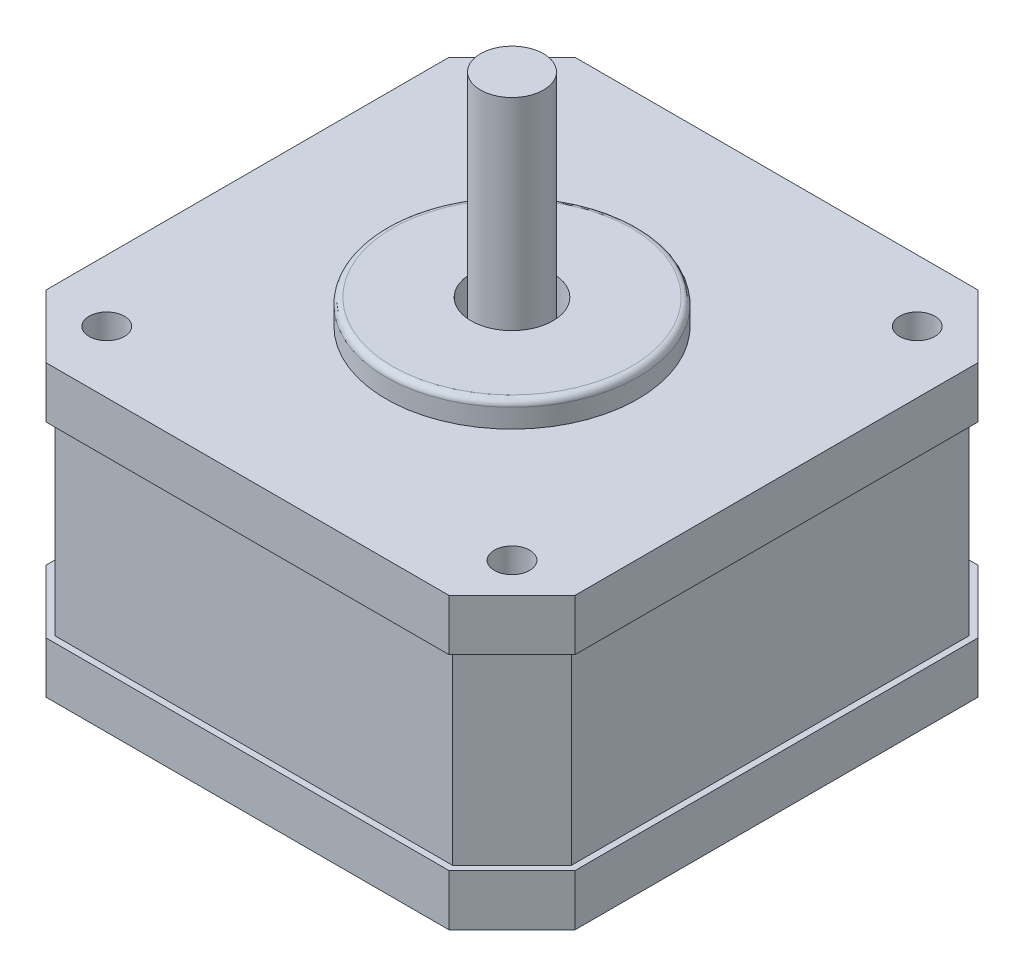
ISO-10303-21;
HEADER;
FILE_DESCRIPTION(('STEP AP214'),'2;1');
FILE_NAME('part.step','',(''),(''),'','','');
FILE_SCHEMA(('AUTOMOTIVE_DESIGN { 1 0 10303 214 1 1 1 1 }'));
ENDSEC;
DATA;
#1=APPLICATION_CONTEXT('core data for automotive mechanical design processes');
#2=APPLICATION_PROTOCOL_DEFINITION('international standard','automotive_design',2000,#1);
#3=PRODUCT_CONTEXT('',#1,'mechanical');
#4=PRODUCT('Part','Part','',(#3));
#5=PRODUCT_RELATED_PRODUCT_CATEGORY('part','',(#4));
#6=PRODUCT_DEFINITION_FORMATION('','',#4);
#7=PRODUCT_DEFINITION_CONTEXT('part definition',#1,'design');
#8=PRODUCT_DEFINITION('design','',#6,#7);
#9=PRODUCT_DEFINITION_SHAPE('','',#8);
#10=(LENGTH_UNIT() NAMED_UNIT(*) SI_UNIT(.MILLI.,.METRE.));
#11=(NAMED_UNIT(*) PLANE_ANGLE_UNIT() SI_UNIT($,.RADIAN.));
#12=(NAMED_UNIT(*) SI_UNIT($,.STERADIAN.) SOLID_ANGLE_UNIT());
#13=UNCERTAINTY_MEASURE_WITH_UNIT(LENGTH_MEASURE(1.E-05),#10,'distance_accuracy_value','');
#14=(GEOMETRIC_REPRESENTATION_CONTEXT(3) GLOBAL_UNCERTAINTY_ASSIGNED_CONTEXT((#13)) GLOBAL_UNIT_ASSIGNED_CONTEXT((#10,
#11,#12)) REPRESENTATION_CONTEXT('',''));
#15=CARTESIAN_POINT('',(0.,0.,0.));
#16=DIRECTION('',(0.,0.,1.));
#17=DIRECTION('',(1.,0.,0.));
#18=AXIS2_PLACEMENT_3D('',#15,#16,#17);
#19=CARTESIAN_POINT('',(0.,0.,-20.5));
#20=DIRECTION('',(0.,0.,1.));
#21=DIRECTION('',(-1.,0.,0.));
#22=AXIS2_PLACEMENT_3D('',#19,#20,#21);
#23=PLANE('',#22);
#24=DIRECTION('',(0.,1.,0.));
#25=VECTOR('',#24,1.);
#26=CARTESIAN_POINT('',(15.7928932188135,0.,-20.5));
#27=LINE('',#26,#25);
#28=CARTESIAN_POINT('',(15.7928932188135,4.07772584032516,-20.5));
#29=VERTEX_POINT('',#28);
#30=CARTESIAN_POINT('',(15.7928932188135,18.9222741596748,-20.5));
#31=VERTEX_POINT('',#30);
#32=EDGE_CURVE('E532',#29,#31,#27,.T.);
#33=ORIENTED_EDGE('',*,*,#32,.F.);
#34=DIRECTION('',(1.,0.,0.));
#35=VECTOR('',#34,1.);
#36=CARTESIAN_POINT('',(-36.7941492494595,4.07772584032516,-20.5));
#37=LINE('',#36,#35);
#38=CARTESIAN_POINT('',(-15.7928932188135,4.07772584032516,-20.5));
#39=VERTEX_POINT('',#38);
#40=EDGE_CURVE('E210',#39,#29,#37,.T.);
#41=ORIENTED_EDGE('',*,*,#40,.F.);
#42=DIRECTION('',(0.,-1.,0.));
#43=VECTOR('',#42,1.);
#44=CARTESIAN_POINT('',(-15.7928932188135,0.,-20.5));
#45=LINE('',#44,#43);
#46=CARTESIAN_POINT('',(-15.7928932188135,18.9222741596748,-20.5));
#47=VERTEX_POINT('',#46);
#48=EDGE_CURVE('E361',#47,#39,#45,.T.);
#49=ORIENTED_EDGE('',*,*,#48,.F.);
#50=DIRECTION('',(-1.,0.,0.));
#51=VECTOR('',#50,1.);
#52=CARTESIAN_POINT('',(-36.7941492494595,18.9222741596748,-20.5));
#53=LINE('',#52,#51);
#54=EDGE_CURVE('E242',#31,#47,#53,.T.);
#55=ORIENTED_EDGE('',*,*,#54,.F.);
#56=EDGE_LOOP('',(#33,#41,#49,#55));
#57=FACE_BOUND('',#56,.T.);
#58=ADVANCED_FACE('F32',(#57),#23,.F.);
#59=CARTESIAN_POINT('',(16.,23.,-21.));
#60=DIRECTION('',(-0.707106781186549,0.,0.707106781186547));
#61=DIRECTION('',(0.,-1.,0.));
#62=AXIS2_PLACEMENT_3D('',#59,#60,#61);
#63=PLANE('',#62);
#64=DIRECTION('',(0.,1.,0.));
#65=VECTOR('',#64,1.);
#66=CARTESIAN_POINT('',(21.,23.,-16.));
#67=LINE('',#66,#65);
#68=CARTESIAN_POINT('',(21.,18.9222741596748,-16.));
#69=VERTEX_POINT('',#68);
#70=CARTESIAN_POINT('',(21.,23.,-16.));
#71=VERTEX_POINT('',#70);
#72=EDGE_CURVE('E338',#69,#71,#67,.T.);
#73=ORIENTED_EDGE('',*,*,#72,.F.);
#74=DIRECTION('',(0.707106781186547,0.,0.707106781186549));
#75=VECTOR('',#74,1.);
#76=CARTESIAN_POINT('',(16.,18.9222741596748,-21.));
#77=LINE('',#76,#75);
#78=CARTESIAN_POINT('',(16.,18.9222741596748,-21.));
#79=VERTEX_POINT('',#78);
#80=EDGE_CURVE('E249',#69,#79,#77,.F.);
#81=ORIENTED_EDGE('',*,*,#80,.T.);
#82=DIRECTION('',(0.,-1.,0.));
#83=VECTOR('',#82,1.);
#84=CARTESIAN_POINT('',(16.,23.,-21.));
#85=LINE('',#84,#83);
#86=CARTESIAN_POINT('',(16.,23.,-21.));
#87=VERTEX_POINT('',#86);
#88=EDGE_CURVE('E333',#87,#79,#85,.T.);
#89=ORIENTED_EDGE('',*,*,#88,.F.);
#90=DIRECTION('',(0.707106781186547,0.,0.707106781186549));
#91=VECTOR('',#90,1.);
#92=CARTESIAN_POINT('',(16.,23.,-21.));
#93=LINE('',#92,#91);
#94=EDGE_CURVE('E342',#71,#87,#93,.F.);
#95=ORIENTED_EDGE('',*,*,#94,.F.);
#96=EDGE_LOOP('',(#73,#81,#89,#95));
#97=FACE_BOUND('',#96,.T.);
#98=ADVANCED_FACE('F389',(#97),#63,.F.);
#99=CARTESIAN_POINT('',(20.5,0.,0.));
#100=DIRECTION('',(-1.,0.,0.));
#101=DIRECTION('',(0.,0.,1.));
#102=AXIS2_PLACEMENT_3D('',#99,#100,#101);
#103=PLANE('',#102);
#104=DIRECTION('',(0.,-1.,0.));
#105=VECTOR('',#104,1.);
#106=CARTESIAN_POINT('',(20.5,0.,-15.7928932188134));
#107=LINE('',#106,#105);
#108=CARTESIAN_POINT('',(20.5,18.9222741596748,-15.7928932188134));
#109=VERTEX_POINT('',#108);
#110=CARTESIAN_POINT('',(20.5,4.07772584032516,-15.7928932188134));
#111=VERTEX_POINT('',#110);
#112=EDGE_CURVE('E190',#109,#111,#107,.T.);
#113=ORIENTED_EDGE('',*,*,#112,.F.);
#114=DIRECTION('',(0.,0.,1.));
#115=VECTOR('',#114,1.);
#116=CARTESIAN_POINT('',(20.5,18.9222741596748,24.2519215951769));
#117=LINE('',#116,#115);
#118=CARTESIAN_POINT('',(20.5,18.9222741596748,15.7928932188134));
#119=VERTEX_POINT('',#118);
#120=EDGE_CURVE('E217',#109,#119,#117,.T.);
#121=ORIENTED_EDGE('',*,*,#120,.T.);
#122=DIRECTION('',(0.,-1.,0.));
#123=VECTOR('',#122,1.);
#124=CARTESIAN_POINT('',(20.5,0.,15.7928932188134));
#125=LINE('',#124,#123);
#126=CARTESIAN_POINT('',(20.5,4.07772584032516,15.7928932188134));
#127=VERTEX_POINT('',#126);
#128=EDGE_CURVE('E215',#119,#127,#125,.T.);
#129=ORIENTED_EDGE('',*,*,#128,.T.);
#130=DIRECTION('',(0.,0.,-1.));
#131=VECTOR('',#130,1.);
#132=CARTESIAN_POINT('',(20.5,4.07772584032516,24.2519215951769));
#133=LINE('',#132,#131);
#134=EDGE_CURVE('E207',#127,#111,#133,.T.);
#135=ORIENTED_EDGE('',*,*,#134,.T.);
#136=EDGE_LOOP('',(#113,#121,#129,#135));
#137=FACE_BOUND('',#136,.T.);
#138=ADVANCED_FACE('F213',(#137),#103,.F.);
#139=CARTESIAN_POINT('',(-21.,23.,21.));
#140=DIRECTION('',(1.,0.,0.));
#141=DIRECTION('',(0.,0.,-1.));
#142=AXIS2_PLACEMENT_3D('',#139,#140,#141);
#143=PLANE('',#142);
#144=DIRECTION('',(0.,0.,-1.));
#145=VECTOR('',#144,1.);
#146=CARTESIAN_POINT('',(-21.,4.07772584032516,21.));
#147=LINE('',#146,#145);
#148=CARTESIAN_POINT('',(-21.,4.07772584032516,16.));
#149=VERTEX_POINT('',#148);
#150=CARTESIAN_POINT('',(-21.,4.07772584032516,-16.));
#151=VERTEX_POINT('',#150);
#152=EDGE_CURVE('E258',#149,#151,#147,.T.);
#153=ORIENTED_EDGE('',*,*,#152,.T.);
#154=DIRECTION('',(0.,-1.,0.));
#155=VECTOR('',#154,1.);
#156=CARTESIAN_POINT('',(-21.,23.,-16.));
#157=LINE('',#156,#155);
#158=CARTESIAN_POINT('',(-21.,0.,-16.));
#159=VERTEX_POINT('',#158);
#160=EDGE_CURVE('E344',#151,#159,#157,.T.);
#161=ORIENTED_EDGE('',*,*,#160,.T.);
#162=DIRECTION('',(0.,0.,1.));
#163=VECTOR('',#162,1.);
#164=CARTESIAN_POINT('',(-21.,0.,21.));
#165=LINE('',#164,#163);
#166=CARTESIAN_POINT('',(-21.,0.,16.));
#167=VERTEX_POINT('',#166);
#168=EDGE_CURVE('E289',#159,#167,#165,.T.);
#169=ORIENTED_EDGE('',*,*,#168,.T.);
#170=DIRECTION('',(0.,1.,0.));
#171=VECTOR('',#170,1.);
#172=CARTESIAN_POINT('',(-21.,23.,16.));
#173=LINE('',#172,#171);
#174=EDGE_CURVE('E311',#167,#149,#173,.T.);
#175=ORIENTED_EDGE('',*,*,#174,.T.);
#176=EDGE_LOOP('',(#153,#161,#169,#175));
#177=FACE_BOUND('',#176,.T.);
#178=ADVANCED_FACE('F439',(#177),#143,.F.);
#179=CARTESIAN_POINT('',(21.,23.,21.));
#180=DIRECTION('',(-1.,0.,0.));
#181=DIRECTION('',(0.,0.,1.));
#182=AXIS2_PLACEMENT_3D('',#179,#180,#181);
#183=PLANE('',#182);
#184=CARTESIAN_POINT('',(21.,0.,-16.));
#185=VERTEX_POINT('',#184);
#186=CARTESIAN_POINT('',(21.,4.07772584032516,-16.));
#187=VERTEX_POINT('',#186);
#188=EDGE_CURVE('E339',#185,#187,#67,.T.);
#189=ORIENTED_EDGE('',*,*,#188,.T.);
#190=DIRECTION('',(0.,0.,-1.));
#191=VECTOR('',#190,1.);
#192=CARTESIAN_POINT('',(21.,4.07772584032516,21.));
#193=LINE('',#192,#191);
#194=CARTESIAN_POINT('',(21.,4.07772584032516,16.));
#195=VERTEX_POINT('',#194);
#196=EDGE_CURVE('E229',#195,#187,#193,.T.);
#197=ORIENTED_EDGE('',*,*,#196,.F.);
#198=DIRECTION('',(0.,-1.,0.));
#199=VECTOR('',#198,1.);
#200=CARTESIAN_POINT('',(21.,23.,16.));
#201=LINE('',#200,#199);
#202=CARTESIAN_POINT('',(21.,0.,16.));
#203=VERTEX_POINT('',#202);
#204=EDGE_CURVE('E316',#195,#203,#201,.T.);
#205=ORIENTED_EDGE('',*,*,#204,.T.);
#206=DIRECTION('',(0.,0.,-1.));
#207=VECTOR('',#206,1.);
#208=CARTESIAN_POINT('',(21.,0.,21.));
#209=LINE('',#208,#207);
#210=EDGE_CURVE('E269',#203,#185,#209,.T.);
#211=ORIENTED_EDGE('',*,*,#210,.T.);
#212=EDGE_LOOP('',(#189,#197,#205,#211));
#213=FACE_BOUND('',#212,.T.);
#214=ADVANCED_FACE('F411',(#213),#183,.F.);
#215=CARTESIAN_POINT('',(0.,0.,20.5));
#216=DIRECTION('',(0.,0.,-1.));
#217=DIRECTION('',(-1.,0.,0.));
#218=AXIS2_PLACEMENT_3D('',#215,#216,#217);
#219=PLANE('',#218);
#220=DIRECTION('',(0.,-1.,0.));
#221=VECTOR('',#220,1.);
#222=CARTESIAN_POINT('',(15.7928932188135,0.,20.5));
#223=LINE('',#222,#221);
#224=CARTESIAN_POINT('',(15.7928932188135,18.9222741596748,20.5));
#225=VERTEX_POINT('',#224);
#226=CARTESIAN_POINT('',(15.7928932188135,4.07772584032516,20.5));
#227=VERTEX_POINT('',#226);
#228=EDGE_CURVE('E232',#225,#227,#223,.T.);
#229=ORIENTED_EDGE('',*,*,#228,.F.);
#230=DIRECTION('',(-1.,0.,0.));
#231=VECTOR('',#230,1.);
#232=CARTESIAN_POINT('',(-36.7941492494595,18.9222741596748,20.5));
#233=LINE('',#232,#231);
#234=CARTESIAN_POINT('',(-15.7928932188135,18.9222741596748,20.5));
#235=VERTEX_POINT('',#234);
#236=EDGE_CURVE('E263',#225,#235,#233,.T.);
#237=ORIENTED_EDGE('',*,*,#236,.T.);
#238=DIRECTION('',(0.,1.,0.));
#239=VECTOR('',#238,1.);
#240=CARTESIAN_POINT('',(-15.7928932188135,0.,20.5));
#241=LINE('',#240,#239);
#242=CARTESIAN_POINT('',(-15.7928932188135,4.07772584032516,20.5));
#243=VERTEX_POINT('',#242);
#244=EDGE_CURVE('E260',#243,#235,#241,.T.);
#245=ORIENTED_EDGE('',*,*,#244,.F.);
#246=DIRECTION('',(1.,0.,0.));
#247=VECTOR('',#246,1.);
#248=CARTESIAN_POINT('',(-36.7941492494595,4.07772584032516,20.5));
#249=LINE('',#248,#247);
#250=EDGE_CURVE('E266',#243,#227,#249,.T.);
#251=ORIENTED_EDGE('',*,*,#250,.T.);
#252=EDGE_LOOP('',(#229,#237,#245,#251));
#253=FACE_BOUND('',#252,.T.);
#254=ADVANCED_FACE('F407',(#253),#219,.F.);
#255=DIRECTION('',(0.,0.,-1.));
#256=VECTOR('',#255,1.);
#257=CARTESIAN_POINT('',(21.,18.9222741596748,21.));
#258=LINE('',#257,#256);
#259=CARTESIAN_POINT('',(21.,18.9222741596748,16.));
#260=VERTEX_POINT('',#259);
#261=EDGE_CURVE('E226',#260,#69,#258,.T.);
#262=ORIENTED_EDGE('',*,*,#261,.T.);
#263=ORIENTED_EDGE('',*,*,#72,.T.);
#264=DIRECTION('',(0.,0.,-1.));
#265=VECTOR('',#264,1.);
#266=CARTESIAN_POINT('',(21.,23.,21.));
#267=LINE('',#266,#265);
#268=CARTESIAN_POINT('',(21.,23.,16.));
#269=VERTEX_POINT('',#268);
#270=EDGE_CURVE('E270',#269,#71,#267,.T.);
#271=ORIENTED_EDGE('',*,*,#270,.F.);
#272=EDGE_CURVE('E317',#269,#260,#201,.T.);
#273=ORIENTED_EDGE('',*,*,#272,.T.);
#274=EDGE_LOOP('',(#262,#263,#271,#273));
#275=FACE_BOUND('',#274,.T.);
#276=ADVANCED_FACE('F410',(#275),#183,.F.);
#277=CARTESIAN_POINT('',(21.,23.,16.));
#278=DIRECTION('',(-0.707106781186546,0.,-0.707106781186549));
#279=DIRECTION('',(0.,-1.,0.));
#280=AXIS2_PLACEMENT_3D('',#277,#278,#279);
#281=PLANE('',#280);
#282=ORIENTED_EDGE('',*,*,#204,.F.);
#283=DIRECTION('',(-0.707106781186549,0.,0.707106781186546));
#284=VECTOR('',#283,1.);
#285=CARTESIAN_POINT('',(21.,4.07772584032516,16.));
#286=LINE('',#285,#284);
#287=CARTESIAN_POINT('',(16.,4.07772584032516,21.));
#288=VERTEX_POINT('',#287);
#289=EDGE_CURVE('E324',#288,#195,#286,.F.);
#290=ORIENTED_EDGE('',*,*,#289,.F.);
#291=DIRECTION('',(0.,-1.,0.));
#292=VECTOR('',#291,1.);
#293=CARTESIAN_POINT('',(16.,23.,21.));
#294=LINE('',#293,#292);
#295=CARTESIAN_POINT('',(16.,0.,21.));
#296=VERTEX_POINT('',#295);
#297=EDGE_CURVE('E322',#296,#288,#294,.F.);
#298=ORIENTED_EDGE('',*,*,#297,.F.);
#299=DIRECTION('',(0.707106781186549,0.,-0.707106781186546));
#300=VECTOR('',#299,1.);
#301=CARTESIAN_POINT('',(18.5,0.,18.5));
#302=LINE('',#301,#300);
#303=EDGE_CURVE('E320',#203,#296,#302,.F.);
#304=ORIENTED_EDGE('',*,*,#303,.F.);
#305=EDGE_LOOP('',(#282,#290,#298,#304));
#306=FACE_BOUND('',#305,.T.);
#307=ADVANCED_FACE('F446',(#306),#281,.F.);
#308=CARTESIAN_POINT('',(-21.,23.,-16.));
#309=DIRECTION('',(0.707106781186546,0.,0.707106781186549));
#310=DIRECTION('',(0.,-1.,0.));
#311=AXIS2_PLACEMENT_3D('',#308,#309,#310);
#312=PLANE('',#311);
#313=ORIENTED_EDGE('',*,*,#160,.F.);
#314=DIRECTION('',(-0.707106781186549,0.,0.707106781186546));
#315=VECTOR('',#314,1.);
#316=CARTESIAN_POINT('',(-21.,4.07772584032516,-16.));
#317=LINE('',#316,#315);
#318=CARTESIAN_POINT('',(-16.,4.07772584032516,-21.));
#319=VERTEX_POINT('',#318);
#320=EDGE_CURVE('E356',#151,#319,#317,.F.);
#321=ORIENTED_EDGE('',*,*,#320,.T.);
#322=DIRECTION('',(0.,1.,0.));
#323=VECTOR('',#322,1.);
#324=CARTESIAN_POINT('',(-16.,23.,-21.));
#325=LINE('',#324,#323);
#326=CARTESIAN_POINT('',(-16.,0.,-21.));
#327=VERTEX_POINT('',#326);
#328=EDGE_CURVE('E351',#327,#319,#325,.T.);
#329=ORIENTED_EDGE('',*,*,#328,.F.);
#330=DIRECTION('',(-0.707106781186549,0.,0.707106781186546));
#331=VECTOR('',#330,1.);
#332=CARTESIAN_POINT('',(-18.5,0.,-18.5));
#333=LINE('',#332,#331);
#334=EDGE_CURVE('E348',#159,#327,#333,.F.);
#335=ORIENTED_EDGE('',*,*,#334,.F.);
#336=EDGE_LOOP('',(#313,#321,#329,#335));
#337=FACE_BOUND('',#336,.T.);
#338=ADVANCED_FACE('F437',(#337),#312,.F.);
#339=CARTESIAN_POINT('',(-21.,23.,-16.));
#340=VERTEX_POINT('',#339);
#341=CARTESIAN_POINT('',(-21.,18.9222741596748,-16.));
#342=VERTEX_POINT('',#341);
#343=EDGE_CURVE('E345',#340,#342,#157,.T.);
#344=ORIENTED_EDGE('',*,*,#343,.T.);
#345=DIRECTION('',(0.,0.,-1.));
#346=VECTOR('',#345,1.);
#347=CARTESIAN_POINT('',(-21.,18.9222741596748,21.));
#348=LINE('',#347,#346);
#349=CARTESIAN_POINT('',(-21.,18.9222741596748,16.));
#350=VERTEX_POINT('',#349);
#351=EDGE_CURVE('E256',#350,#342,#348,.T.);
#352=ORIENTED_EDGE('',*,*,#351,.F.);
#353=CARTESIAN_POINT('',(-21.,23.,16.));
#354=VERTEX_POINT('',#353);
#355=EDGE_CURVE('E310',#350,#354,#173,.T.);
#356=ORIENTED_EDGE('',*,*,#355,.T.);
#357=DIRECTION('',(0.,0.,1.));
#358=VECTOR('',#357,1.);
#359=CARTESIAN_POINT('',(-21.,23.,21.));
#360=LINE('',#359,#358);
#361=EDGE_CURVE('E277',#340,#354,#360,.T.);
#362=ORIENTED_EDGE('',*,*,#361,.F.);
#363=EDGE_LOOP('',(#344,#352,#356,#362));
#364=FACE_BOUND('',#363,.T.);
#365=ADVANCED_FACE('F433',(#364),#143,.F.);
#366=CARTESIAN_POINT('',(-21.,23.,-21.));
#367=DIRECTION('',(0.,0.,1.));
#368=DIRECTION('',(1.,0.,0.));
#369=AXIS2_PLACEMENT_3D('',#366,#367,#368);
#370=PLANE('',#369);
#371=DIRECTION('',(-1.,0.,0.));
#372=VECTOR('',#371,1.);
#373=CARTESIAN_POINT('',(-36.7941492494595,18.9222741596748,-21.));
#374=LINE('',#373,#372);
#375=CARTESIAN_POINT('',(-16.,18.9222741596748,-21.));
#376=VERTEX_POINT('',#375);
#377=EDGE_CURVE('E243',#79,#376,#374,.T.);
#378=ORIENTED_EDGE('',*,*,#377,.T.);
#379=CARTESIAN_POINT('',(-16.,23.,-21.));
#380=VERTEX_POINT('',#379);
#381=EDGE_CURVE('E350',#376,#380,#325,.T.);
#382=ORIENTED_EDGE('',*,*,#381,.T.);
#383=DIRECTION('',(-1.,0.,0.));
#384=VECTOR('',#383,1.);
#385=CARTESIAN_POINT('',(-21.,23.,-21.));
#386=LINE('',#385,#384);
#387=EDGE_CURVE('E273',#87,#380,#386,.T.);
#388=ORIENTED_EDGE('',*,*,#387,.F.);
#389=ORIENTED_EDGE('',*,*,#88,.T.);
#390=EDGE_LOOP('',(#378,#382,#388,#389));
#391=FACE_BOUND('',#390,.T.);
#392=ADVANCED_FACE('F436',(#391),#370,.F.);
#393=DIRECTION('',(1.,0.,0.));
#394=VECTOR('',#393,1.);
#395=CARTESIAN_POINT('',(-36.7941492494595,4.07772584032516,-21.));
#396=LINE('',#395,#394);
#397=CARTESIAN_POINT('',(16.,4.07772584032516,-21.));
#398=VERTEX_POINT('',#397);
#399=EDGE_CURVE('E240',#319,#398,#396,.T.);
#400=ORIENTED_EDGE('',*,*,#399,.T.);
#401=CARTESIAN_POINT('',(16.,0.,-21.));
#402=VERTEX_POINT('',#401);
#403=EDGE_CURVE('E332',#398,#402,#85,.T.);
#404=ORIENTED_EDGE('',*,*,#403,.T.);
#405=DIRECTION('',(-1.,0.,0.));
#406=VECTOR('',#405,1.);
#407=CARTESIAN_POINT('',(-21.,0.,-21.));
#408=LINE('',#407,#406);
#409=EDGE_CURVE('E286',#402,#327,#408,.T.);
#410=ORIENTED_EDGE('',*,*,#409,.T.);
#411=ORIENTED_EDGE('',*,*,#328,.T.);
#412=EDGE_LOOP('',(#400,#404,#410,#411));
#413=FACE_BOUND('',#412,.T.);
#414=ADVANCED_FACE('F442',(#413),#370,.F.);
#415=DIRECTION('',(-0.707106781186547,0.,-0.707106781186549));
#416=VECTOR('',#415,1.);
#417=CARTESIAN_POINT('',(16.,4.07772584032516,-21.));
#418=LINE('',#417,#416);
#419=EDGE_CURVE('E245',#398,#187,#418,.F.);
#420=ORIENTED_EDGE('',*,*,#419,.T.);
#421=ORIENTED_EDGE('',*,*,#188,.F.);
#422=DIRECTION('',(-0.707106781186547,0.,-0.707106781186549));
#423=VECTOR('',#422,1.);
#424=CARTESIAN_POINT('',(18.5,0.,-18.5));
#425=LINE('',#424,#423);
#426=EDGE_CURVE('E336',#402,#185,#425,.F.);
#427=ORIENTED_EDGE('',*,*,#426,.F.);
#428=ORIENTED_EDGE('',*,*,#403,.F.);
#429=EDGE_LOOP('',(#420,#421,#427,#428));
#430=FACE_BOUND('',#429,.T.);
#431=ADVANCED_FACE('F397',(#430),#63,.F.);
#432=DIRECTION('',(0.707106781186549,0.,-0.707106781186546));
#433=VECTOR('',#432,1.);
#434=CARTESIAN_POINT('',(-21.,18.9222741596748,-16.));
#435=LINE('',#434,#433);
#436=EDGE_CURVE('E358',#376,#342,#435,.F.);
#437=ORIENTED_EDGE('',*,*,#436,.T.);
#438=ORIENTED_EDGE('',*,*,#343,.F.);
#439=DIRECTION('',(0.707106781186549,0.,-0.707106781186546));
#440=VECTOR('',#439,1.);
#441=CARTESIAN_POINT('',(-21.,23.,-16.));
#442=LINE('',#441,#440);
#443=EDGE_CURVE('E354',#380,#340,#442,.F.);
#444=ORIENTED_EDGE('',*,*,#443,.F.);
#445=ORIENTED_EDGE('',*,*,#381,.F.);
#446=EDGE_LOOP('',(#437,#438,#444,#445));
#447=FACE_BOUND('',#446,.T.);
#448=ADVANCED_FACE('F455',(#447),#312,.F.);
#449=CARTESIAN_POINT('',(-16.,23.,21.));
#450=DIRECTION('',(0.707106781186549,0.,-0.707106781186546));
#451=DIRECTION('',(0.,-1.,0.));
#452=AXIS2_PLACEMENT_3D('',#449,#450,#451);
#453=PLANE('',#452);
#454=ORIENTED_EDGE('',*,*,#355,.F.);
#455=DIRECTION('',(0.707106781186546,0.,0.707106781186549));
#456=VECTOR('',#455,1.);
#457=CARTESIAN_POINT('',(-16.,18.9222741596748,21.));
#458=LINE('',#457,#456);
#459=CARTESIAN_POINT('',(-16.,18.9222741596748,21.));
#460=VERTEX_POINT('',#459);
#461=EDGE_CURVE('E301',#460,#350,#458,.F.);
#462=ORIENTED_EDGE('',*,*,#461,.F.);
#463=DIRECTION('',(0.,-1.,0.));
#464=VECTOR('',#463,1.);
#465=CARTESIAN_POINT('',(-16.,23.,21.));
#466=LINE('',#465,#464);
#467=CARTESIAN_POINT('',(-16.,23.,21.));
#468=VERTEX_POINT('',#467);
#469=EDGE_CURVE('E298',#468,#460,#466,.T.);
#470=ORIENTED_EDGE('',*,*,#469,.F.);
#471=DIRECTION('',(-0.707106781186546,0.,-0.707106781186549));
#472=VECTOR('',#471,1.);
#473=CARTESIAN_POINT('',(-16.,23.,21.));
#474=LINE('',#473,#472);
#475=EDGE_CURVE('E314',#354,#468,#474,.F.);
#476=ORIENTED_EDGE('',*,*,#475,.F.);
#477=EDGE_LOOP('',(#454,#462,#470,#476));
#478=FACE_BOUND('',#477,.T.);
#479=ADVANCED_FACE('F451',(#478),#453,.F.);
#480=CARTESIAN_POINT('',(-21.,23.,21.));
#481=DIRECTION('',(0.,0.,-1.));
#482=DIRECTION('',(-1.,0.,0.));
#483=AXIS2_PLACEMENT_3D('',#480,#481,#482);
#484=PLANE('',#483);
#485=DIRECTION('',(1.,0.,0.));
#486=VECTOR('',#485,1.);
#487=CARTESIAN_POINT('',(-21.,0.,21.));
#488=LINE('',#487,#486);
#489=CARTESIAN_POINT('',(-16.,0.,21.));
#490=VERTEX_POINT('',#489);
#491=EDGE_CURVE('E274',#490,#296,#488,.T.);
#492=ORIENTED_EDGE('',*,*,#491,.T.);
#493=ORIENTED_EDGE('',*,*,#297,.T.);
#494=DIRECTION('',(-1.,0.,0.));
#495=VECTOR('',#494,1.);
#496=CARTESIAN_POINT('',(-21.,4.07772584032516,21.));
#497=LINE('',#496,#495);
#498=CARTESIAN_POINT('',(-16.,4.07772584032516,21.));
#499=VERTEX_POINT('',#498);
#500=EDGE_CURVE('E295',#288,#499,#497,.T.);
#501=ORIENTED_EDGE('',*,*,#500,.T.);
#502=DIRECTION('',(0.,1.,0.));
#503=VECTOR('',#502,1.);
#504=CARTESIAN_POINT('',(-16.,23.,21.));
#505=LINE('',#504,#503);
#506=EDGE_CURVE('E305',#499,#490,#505,.F.);
#507=ORIENTED_EDGE('',*,*,#506,.T.);
#508=EDGE_LOOP('',(#492,#493,#501,#507));
#509=FACE_BOUND('',#508,.T.);
#510=ADVANCED_FACE('F431',(#509),#484,.F.);
#511=DIRECTION('',(1.,0.,0.));
#512=VECTOR('',#511,1.);
#513=CARTESIAN_POINT('',(-21.,18.9222741596748,21.));
#514=LINE('',#513,#512);
#515=CARTESIAN_POINT('',(16.,18.9222741596748,21.));
#516=VERTEX_POINT('',#515);
#517=EDGE_CURVE('E283',#460,#516,#514,.T.);
#518=ORIENTED_EDGE('',*,*,#517,.T.);
#519=DIRECTION('',(0.,1.,0.));
#520=VECTOR('',#519,1.);
#521=CARTESIAN_POINT('',(16.,23.,21.));
#522=LINE('',#521,#520);
#523=CARTESIAN_POINT('',(16.,23.,21.));
#524=VERTEX_POINT('',#523);
#525=EDGE_CURVE('E328',#516,#524,#522,.T.);
#526=ORIENTED_EDGE('',*,*,#525,.T.);
#527=DIRECTION('',(1.,0.,0.));
#528=VECTOR('',#527,1.);
#529=CARTESIAN_POINT('',(-21.,23.,21.));
#530=LINE('',#529,#528);
#531=EDGE_CURVE('E280',#468,#524,#530,.T.);
#532=ORIENTED_EDGE('',*,*,#531,.F.);
#533=ORIENTED_EDGE('',*,*,#469,.T.);
#534=EDGE_LOOP('',(#518,#526,#532,#533));
#535=FACE_BOUND('',#534,.T.);
#536=ADVANCED_FACE('F424',(#535),#484,.F.);
#537=CARTESIAN_POINT('',(0.,23.,0.));
#538=DIRECTION('',(0.,-1.,0.));
#539=DIRECTION('',(0.,0.,-1.));
#540=AXIS2_PLACEMENT_3D('',#537,#538,#539);
#541=PLANE('',#540);
#542=CARTESIAN_POINT('',(0.,23.,0.));
#543=DIRECTION('',(0.,-1.,0.));
#544=DIRECTION('',(0.,0.,-1.));
#545=AXIS2_PLACEMENT_3D('',#542,#543,#544);
#546=CIRCLE('',#545,10.);
#547=CARTESIAN_POINT('',(0.,23.,-10.));
#548=VERTEX_POINT('',#547);
#549=EDGE_CURVE('E198',#548,#548,#546,.F.);
#550=ORIENTED_EDGE('',*,*,#549,.F.);
#551=EDGE_LOOP('',(#550));
#552=FACE_BOUND('',#551,.T.);
#553=CARTESIAN_POINT('',(-16.0875680166067,23.,16.0875680166067));
#554=DIRECTION('',(0.,1.,0.));
#555=DIRECTION('',(0.,0.,-1.));
#556=AXIS2_PLACEMENT_3D('',#553,#554,#555);
#557=CIRCLE('',#556,1.39937189658075);
#558=CARTESIAN_POINT('',(-16.0875680166067,23.,14.688196120026));
#559=VERTEX_POINT('',#558);
#560=EDGE_CURVE('E370',#559,#559,#557,.T.);
#561=ORIENTED_EDGE('',*,*,#560,.F.);
#562=EDGE_LOOP('',(#561));
#563=FACE_BOUND('',#562,.T.);
#564=CARTESIAN_POINT('',(16.0875680166067,23.,16.0875680166067));
#565=DIRECTION('',(0.,1.,0.));
#566=DIRECTION('',(0.,0.,1.));
#567=AXIS2_PLACEMENT_3D('',#564,#565,#566);
#568=CIRCLE('',#567,1.39937189658075);
#569=CARTESIAN_POINT('',(16.0875680166067,23.,17.4869399131875));
#570=VERTEX_POINT('',#569);
#571=EDGE_CURVE('E549',#570,#570,#568,.T.);
#572=ORIENTED_EDGE('',*,*,#571,.F.);
#573=EDGE_LOOP('',(#572));
#574=FACE_BOUND('',#573,.T.);
#575=CARTESIAN_POINT('',(16.0875680166067,23.,-16.0875680166067));
#576=DIRECTION('',(0.,1.,0.));
#577=DIRECTION('',(0.,0.,-1.));
#578=AXIS2_PLACEMENT_3D('',#575,#576,#577);
#579=CIRCLE('',#578,1.39937189658075);
#580=CARTESIAN_POINT('',(16.0875680166067,23.,-17.4869399131875));
#581=VERTEX_POINT('',#580);
#582=EDGE_CURVE('E543',#581,#581,#579,.T.);
#583=ORIENTED_EDGE('',*,*,#582,.F.);
#584=EDGE_LOOP('',(#583));
#585=FACE_BOUND('',#584,.T.);
#586=CARTESIAN_POINT('',(-16.0875680166067,23.,-16.0875680166067));
#587=DIRECTION('',(0.,1.,0.));
#588=DIRECTION('',(0.,0.,1.));
#589=AXIS2_PLACEMENT_3D('',#586,#587,#588);
#590=CIRCLE('',#589,1.39937189658075);
#591=CARTESIAN_POINT('',(-16.0875680166067,23.,-14.688196120026));
#592=VERTEX_POINT('',#591);
#593=EDGE_CURVE('E537',#592,#592,#590,.T.);
#594=ORIENTED_EDGE('',*,*,#593,.F.);
#595=EDGE_LOOP('',(#594));
#596=FACE_BOUND('',#595,.T.);
#597=ORIENTED_EDGE('',*,*,#387,.T.);
#598=ORIENTED_EDGE('',*,*,#443,.T.);
#599=ORIENTED_EDGE('',*,*,#361,.T.);
#600=ORIENTED_EDGE('',*,*,#475,.T.);
#601=ORIENTED_EDGE('',*,*,#531,.T.);
#602=DIRECTION('',(-0.707106781186549,0.,0.707106781186546));
#603=VECTOR('',#602,1.);
#604=CARTESIAN_POINT('',(21.,23.,16.));
#605=LINE('',#604,#603);
#606=EDGE_CURVE('E330',#524,#269,#605,.F.);
#607=ORIENTED_EDGE('',*,*,#606,.T.);
#608=ORIENTED_EDGE('',*,*,#270,.T.);
#609=ORIENTED_EDGE('',*,*,#94,.T.);
#610=EDGE_LOOP('',(#597,#598,#599,#600,#601,#607,#608,#609));
#611=FACE_BOUND('',#610,.T.);
#612=ADVANCED_FACE('F421',(#552,#563,#574,#585,#596,#611),#541,.F.);
#613=CARTESIAN_POINT('',(0.,0.,0.));
#614=DIRECTION('',(0.,-1.,0.));
#615=DIRECTION('',(0.,0.,-1.));
#616=AXIS2_PLACEMENT_3D('',#613,#614,#615);
#617=PLANE('',#616);
#618=ORIENTED_EDGE('',*,*,#168,.F.);
#619=ORIENTED_EDGE('',*,*,#334,.T.);
#620=ORIENTED_EDGE('',*,*,#409,.F.);
#621=ORIENTED_EDGE('',*,*,#426,.T.);
#622=ORIENTED_EDGE('',*,*,#210,.F.);
#623=ORIENTED_EDGE('',*,*,#303,.T.);
#624=ORIENTED_EDGE('',*,*,#491,.F.);
#625=DIRECTION('',(0.707106781186546,0.,0.707106781186549));
#626=VECTOR('',#625,1.);
#627=CARTESIAN_POINT('',(-18.5,0.,18.5));
#628=LINE('',#627,#626);
#629=EDGE_CURVE('E307',#490,#167,#628,.F.);
#630=ORIENTED_EDGE('',*,*,#629,.T.);
#631=EDGE_LOOP('',(#618,#619,#620,#621,#622,#623,#624,#630));
#632=FACE_BOUND('',#631,.T.);
#633=ADVANCED_FACE('F416',(#632),#617,.T.);
#634=CARTESIAN_POINT('',(-36.7941492494595,4.07772584032516,20.5));
#635=DIRECTION('',(0.,-1.,0.));
#636=DIRECTION('',(0.,0.,-1.));
#637=AXIS2_PLACEMENT_3D('',#634,#635,#636);
#638=PLANE('',#637);
#639=DIRECTION('',(0.,0.,1.));
#640=VECTOR('',#639,1.);
#641=CARTESIAN_POINT('',(-20.5,4.07772584032516,-19.0913819471122));
#642=LINE('',#641,#640);
#643=CARTESIAN_POINT('',(-20.5,4.07772584032516,-15.7928932188134));
#644=VERTEX_POINT('',#643);
#645=CARTESIAN_POINT('',(-20.5,4.07772584032516,15.7928932188134));
#646=VERTEX_POINT('',#645);
#647=EDGE_CURVE('E526',#644,#646,#642,.T.);
#648=ORIENTED_EDGE('',*,*,#647,.F.);
#649=DIRECTION('',(0.707106781186546,0.,-0.707106781186549));
#650=VECTOR('',#649,1.);
#651=CARTESIAN_POINT('',(-22.1786212095452,4.07772584032516,-14.1142720092682));
#652=LINE('',#651,#650);
#653=EDGE_CURVE('E235',#644,#39,#652,.T.);
#654=ORIENTED_EDGE('',*,*,#653,.T.);
#655=ORIENTED_EDGE('',*,*,#40,.T.);
#656=DIRECTION('',(-0.707106781186546,0.,-0.707106781186549));
#657=VECTOR('',#656,1.);
#658=CARTESIAN_POINT('',(22.1786212095452,4.07772584032516,-14.1142720092682));
#659=LINE('',#658,#657);
#660=EDGE_CURVE('E193',#111,#29,#659,.T.);
#661=ORIENTED_EDGE('',*,*,#660,.F.);
#662=ORIENTED_EDGE('',*,*,#134,.F.);
#663=DIRECTION('',(-0.707106781186546,0.,0.707106781186549));
#664=VECTOR('',#663,1.);
#665=CARTESIAN_POINT('',(22.1786212095452,4.07772584032516,14.1142720092682));
#666=LINE('',#665,#664);
#667=EDGE_CURVE('E216',#127,#227,#666,.T.);
#668=ORIENTED_EDGE('',*,*,#667,.T.);
#669=ORIENTED_EDGE('',*,*,#250,.F.);
#670=DIRECTION('',(0.707106781186546,0.,0.707106781186549));
#671=VECTOR('',#670,1.);
#672=CARTESIAN_POINT('',(-22.1786212095452,4.07772584032516,14.1142720092682));
#673=LINE('',#672,#671);
#674=EDGE_CURVE('E252',#646,#243,#673,.T.);
#675=ORIENTED_EDGE('',*,*,#674,.F.);
#676=EDGE_LOOP('',(#648,#654,#655,#661,#662,#668,#669,#675));
#677=FACE_BOUND('',#676,.T.);
#678=ORIENTED_EDGE('',*,*,#320,.F.);
#679=ORIENTED_EDGE('',*,*,#152,.F.);
#680=DIRECTION('',(-0.707106781186546,0.,-0.707106781186549));
#681=VECTOR('',#680,1.);
#682=CARTESIAN_POINT('',(-16.,4.07772584032516,21.));
#683=LINE('',#682,#681);
#684=EDGE_CURVE('E303',#149,#499,#683,.F.);
#685=ORIENTED_EDGE('',*,*,#684,.T.);
#686=ORIENTED_EDGE('',*,*,#500,.F.);
#687=ORIENTED_EDGE('',*,*,#289,.T.);
#688=ORIENTED_EDGE('',*,*,#196,.T.);
#689=ORIENTED_EDGE('',*,*,#419,.F.);
#690=ORIENTED_EDGE('',*,*,#399,.F.);
#691=EDGE_LOOP('',(#678,#679,#685,#686,#687,#688,#689,#690));
#692=FACE_BOUND('',#691,.T.);
#693=ADVANCED_FACE('F205',(#677,#692),#638,.F.);
#694=CARTESIAN_POINT('',(-36.7941492494595,18.9222741596748,20.5));
#695=DIRECTION('',(0.,1.,0.));
#696=DIRECTION('',(0.,0.,1.));
#697=AXIS2_PLACEMENT_3D('',#694,#695,#696);
#698=PLANE('',#697);
#699=ORIENTED_EDGE('',*,*,#54,.T.);
#700=DIRECTION('',(0.707106781186546,0.,-0.707106781186549));
#701=VECTOR('',#700,1.);
#702=CARTESIAN_POINT('',(-22.1786212095452,18.9222741596748,-14.1142720092682));
#703=LINE('',#702,#701);
#704=CARTESIAN_POINT('',(-20.5,18.9222741596748,-15.7928932188134));
#705=VERTEX_POINT('',#704);
#706=EDGE_CURVE('E237',#705,#47,#703,.T.);
#707=ORIENTED_EDGE('',*,*,#706,.F.);
#708=DIRECTION('',(0.,0.,-1.));
#709=VECTOR('',#708,1.);
#710=CARTESIAN_POINT('',(-20.5,18.9222741596748,-19.0913819471122));
#711=LINE('',#710,#709);
#712=CARTESIAN_POINT('',(-20.5,18.9222741596748,15.7928932188134));
#713=VERTEX_POINT('',#712);
#714=EDGE_CURVE('E55',#713,#705,#711,.T.);
#715=ORIENTED_EDGE('',*,*,#714,.F.);
#716=DIRECTION('',(0.707106781186546,0.,0.707106781186549));
#717=VECTOR('',#716,1.);
#718=CARTESIAN_POINT('',(-22.1786212095452,18.9222741596748,14.1142720092682));
#719=LINE('',#718,#717);
#720=EDGE_CURVE('E254',#713,#235,#719,.T.);
#721=ORIENTED_EDGE('',*,*,#720,.T.);
#722=ORIENTED_EDGE('',*,*,#236,.F.);
#723=DIRECTION('',(-0.707106781186546,0.,0.707106781186549));
#724=VECTOR('',#723,1.);
#725=CARTESIAN_POINT('',(22.1786212095452,18.9222741596748,14.1142720092682));
#726=LINE('',#725,#724);
#727=EDGE_CURVE('E219',#119,#225,#726,.T.);
#728=ORIENTED_EDGE('',*,*,#727,.F.);
#729=ORIENTED_EDGE('',*,*,#120,.F.);
#730=DIRECTION('',(-0.707106781186546,0.,-0.707106781186549));
#731=VECTOR('',#730,1.);
#732=CARTESIAN_POINT('',(22.1786212095452,18.9222741596748,-14.1142720092682));
#733=LINE('',#732,#731);
#734=EDGE_CURVE('E47',#109,#31,#733,.T.);
#735=ORIENTED_EDGE('',*,*,#734,.T.);
#736=EDGE_LOOP('',(#699,#707,#715,#721,#722,#728,#729,#735));
#737=FACE_BOUND('',#736,.T.);
#738=ORIENTED_EDGE('',*,*,#436,.F.);
#739=ORIENTED_EDGE('',*,*,#377,.F.);
#740=ORIENTED_EDGE('',*,*,#80,.F.);
#741=ORIENTED_EDGE('',*,*,#261,.F.);
#742=DIRECTION('',(0.707106781186549,0.,-0.707106781186546));
#743=VECTOR('',#742,1.);
#744=CARTESIAN_POINT('',(21.,18.9222741596748,16.));
#745=LINE('',#744,#743);
#746=EDGE_CURVE('E326',#260,#516,#745,.F.);
#747=ORIENTED_EDGE('',*,*,#746,.T.);
#748=ORIENTED_EDGE('',*,*,#517,.F.);
#749=ORIENTED_EDGE('',*,*,#461,.T.);
#750=ORIENTED_EDGE('',*,*,#351,.T.);
#751=EDGE_LOOP('',(#738,#739,#740,#741,#747,#748,#749,#750));
#752=FACE_BOUND('',#751,.T.);
#753=ADVANCED_FACE('F415',(#737,#752),#698,.F.);
#754=ORIENTED_EDGE('',*,*,#684,.F.);
#755=ORIENTED_EDGE('',*,*,#174,.F.);
#756=ORIENTED_EDGE('',*,*,#629,.F.);
#757=ORIENTED_EDGE('',*,*,#506,.F.);
#758=EDGE_LOOP('',(#754,#755,#756,#757));
#759=FACE_BOUND('',#758,.T.);
#760=ADVANCED_FACE('F419',(#759),#453,.F.);
#761=ORIENTED_EDGE('',*,*,#746,.F.);
#762=ORIENTED_EDGE('',*,*,#272,.F.);
#763=ORIENTED_EDGE('',*,*,#606,.F.);
#764=ORIENTED_EDGE('',*,*,#525,.F.);
#765=EDGE_LOOP('',(#761,#762,#763,#764));
#766=FACE_BOUND('',#765,.T.);
#767=ADVANCED_FACE('F405',(#766),#281,.F.);
#768=CARTESIAN_POINT('',(-18.1464466094068,0.,18.1464466094067));
#769=DIRECTION('',(-0.707106781186549,0.,0.707106781186546));
#770=DIRECTION('',(0.707106781186546,0.,0.707106781186549));
#771=AXIS2_PLACEMENT_3D('',#768,#769,#770);
#772=PLANE('',#771);
#773=DIRECTION('',(0.,1.,0.));
#774=VECTOR('',#773,1.);
#775=CARTESIAN_POINT('',(-20.5,0.,15.7928932188134));
#776=LINE('',#775,#774);
#777=EDGE_CURVE('E221',#646,#713,#776,.T.);
#778=ORIENTED_EDGE('',*,*,#777,.F.);
#779=ORIENTED_EDGE('',*,*,#674,.T.);
#780=ORIENTED_EDGE('',*,*,#244,.T.);
#781=ORIENTED_EDGE('',*,*,#720,.F.);
#782=EDGE_LOOP('',(#778,#779,#780,#781));
#783=FACE_BOUND('',#782,.T.);
#784=ADVANCED_FACE('F402',(#783),#772,.T.);
#785=CARTESIAN_POINT('',(-18.1464466094068,0.,-18.1464466094067));
#786=DIRECTION('',(-0.707106781186549,0.,-0.707106781186546));
#787=DIRECTION('',(0.707106781186546,0.,-0.707106781186549));
#788=AXIS2_PLACEMENT_3D('',#785,#786,#787);
#789=PLANE('',#788);
#790=DIRECTION('',(0.,-1.,0.));
#791=VECTOR('',#790,1.);
#792=CARTESIAN_POINT('',(-20.5,0.,-15.7928932188134));
#793=LINE('',#792,#791);
#794=EDGE_CURVE('E199',#705,#644,#793,.T.);
#795=ORIENTED_EDGE('',*,*,#794,.F.);
#796=ORIENTED_EDGE('',*,*,#706,.T.);
#797=ORIENTED_EDGE('',*,*,#48,.T.);
#798=ORIENTED_EDGE('',*,*,#653,.F.);
#799=EDGE_LOOP('',(#795,#796,#797,#798));
#800=FACE_BOUND('',#799,.T.);
#801=ADVANCED_FACE('F400',(#800),#789,.T.);
#802=CARTESIAN_POINT('',(18.1464466094068,0.,18.1464466094067));
#803=DIRECTION('',(0.707106781186549,0.,0.707106781186546));
#804=DIRECTION('',(-0.707106781186546,0.,0.707106781186549));
#805=AXIS2_PLACEMENT_3D('',#802,#803,#804);
#806=PLANE('',#805);
#807=ORIENTED_EDGE('',*,*,#128,.F.);
#808=ORIENTED_EDGE('',*,*,#727,.T.);
#809=ORIENTED_EDGE('',*,*,#228,.T.);
#810=ORIENTED_EDGE('',*,*,#667,.F.);
#811=EDGE_LOOP('',(#807,#808,#809,#810));
#812=FACE_BOUND('',#811,.T.);
#813=ADVANCED_FACE('F509',(#812),#806,.T.);
#814=CARTESIAN_POINT('',(-20.5,0.,0.));
#815=DIRECTION('',(1.,0.,0.));
#816=DIRECTION('',(0.,0.,-1.));
#817=AXIS2_PLACEMENT_3D('',#814,#815,#816);
#818=PLANE('',#817);
#819=ORIENTED_EDGE('',*,*,#777,.T.);
#820=ORIENTED_EDGE('',*,*,#714,.T.);
#821=ORIENTED_EDGE('',*,*,#794,.T.);
#822=ORIENTED_EDGE('',*,*,#647,.T.);
#823=EDGE_LOOP('',(#819,#820,#821,#822));
#824=FACE_BOUND('',#823,.T.);
#825=ADVANCED_FACE('F507',(#824),#818,.F.);
#826=CARTESIAN_POINT('',(18.1464466094068,0.,-18.1464466094067));
#827=DIRECTION('',(0.707106781186549,0.,-0.707106781186546));
#828=DIRECTION('',(-0.707106781186546,0.,-0.707106781186549));
#829=AXIS2_PLACEMENT_3D('',#826,#827,#828);
#830=PLANE('',#829);
#831=ORIENTED_EDGE('',*,*,#32,.T.);
#832=ORIENTED_EDGE('',*,*,#734,.F.);
#833=ORIENTED_EDGE('',*,*,#112,.T.);
#834=ORIENTED_EDGE('',*,*,#660,.T.);
#835=EDGE_LOOP('',(#831,#832,#833,#834));
#836=FACE_BOUND('',#835,.T.);
#837=ADVANCED_FACE('F192',(#836),#830,.T.);
#838=CARTESIAN_POINT('',(-16.0875680166067,18.,-16.0875680166067));
#839=DIRECTION('',(0.,1.,0.));
#840=DIRECTION('',(0.,0.,1.));
#841=AXIS2_PLACEMENT_3D('',#838,#839,#840);
#842=CYLINDRICAL_SURFACE('',#841,1.39937189658075);
#843=CARTESIAN_POINT('',(-16.0875680166067,18.,-16.0875680166067));
#844=DIRECTION('',(0.,1.,0.));
#845=DIRECTION('',(0.,0.,1.));
#846=AXIS2_PLACEMENT_3D('',#843,#844,#845);
#847=CIRCLE('',#846,1.39937189658075);
#848=CARTESIAN_POINT('',(-16.0875680166067,18.,-14.688196120026));
#849=VERTEX_POINT('',#848);
#850=EDGE_CURVE('E211',#849,#849,#847,.T.);
#851=ORIENTED_EDGE('',*,*,#850,.F.);
#852=EDGE_LOOP('',(#851));
#853=FACE_BOUND('',#852,.T.);
#854=ORIENTED_EDGE('',*,*,#593,.T.);
#855=EDGE_LOOP('',(#854));
#856=FACE_BOUND('',#855,.T.);
#857=ADVANCED_FACE('F620',(#853,#856),#842,.F.);
#858=CARTESIAN_POINT('',(-16.0875680166067,18.,-16.0875680166067));
#859=DIRECTION('',(0.,1.,0.));
#860=DIRECTION('',(0.,0.,1.));
#861=AXIS2_PLACEMENT_3D('',#858,#859,#860);
#862=PLANE('',#861);
#863=ORIENTED_EDGE('',*,*,#850,.T.);
#864=EDGE_LOOP('',(#863));
#865=FACE_BOUND('',#864,.T.);
#866=ADVANCED_FACE('F616',(#865),#862,.T.);
#867=CARTESIAN_POINT('',(16.0875680166067,18.,-16.0875680166067));
#868=DIRECTION('',(0.,1.,0.));
#869=DIRECTION('',(0.,0.,1.));
#870=AXIS2_PLACEMENT_3D('',#867,#868,#869);
#871=CYLINDRICAL_SURFACE('',#870,1.39937189658075);
#872=CARTESIAN_POINT('',(16.0875680166067,18.,-16.0875680166067));
#873=DIRECTION('',(0.,1.,0.));
#874=DIRECTION('',(0.,0.,-1.));
#875=AXIS2_PLACEMENT_3D('',#872,#873,#874);
#876=CIRCLE('',#875,1.39937189658075);
#877=CARTESIAN_POINT('',(16.0875680166067,18.,-17.4869399131875));
#878=VERTEX_POINT('',#877);
#879=EDGE_CURVE('E540',#878,#878,#876,.T.);
#880=ORIENTED_EDGE('',*,*,#879,.F.);
#881=EDGE_LOOP('',(#880));
#882=FACE_BOUND('',#881,.T.);
#883=ORIENTED_EDGE('',*,*,#582,.T.);
#884=EDGE_LOOP('',(#883));
#885=FACE_BOUND('',#884,.T.);
#886=ADVANCED_FACE('F612',(#882,#885),#871,.F.);
#887=CARTESIAN_POINT('',(16.0875680166067,18.,-16.0875680166067));
#888=DIRECTION('',(0.,-1.,0.));
#889=DIRECTION('',(0.,0.,-1.));
#890=AXIS2_PLACEMENT_3D('',#887,#888,#889);
#891=PLANE('',#890);
#892=ORIENTED_EDGE('',*,*,#879,.T.);
#893=EDGE_LOOP('',(#892));
#894=FACE_BOUND('',#893,.T.);
#895=ADVANCED_FACE('F608',(#894),#891,.F.);
#896=CARTESIAN_POINT('',(16.0875680166067,18.,16.0875680166067));
#897=DIRECTION('',(0.,1.,0.));
#898=DIRECTION('',(0.,0.,1.));
#899=AXIS2_PLACEMENT_3D('',#896,#897,#898);
#900=CYLINDRICAL_SURFACE('',#899,1.39937189658075);
#901=CARTESIAN_POINT('',(16.0875680166067,18.,16.0875680166067));
#902=DIRECTION('',(0.,1.,0.));
#903=DIRECTION('',(0.,0.,1.));
#904=AXIS2_PLACEMENT_3D('',#901,#902,#903);
#905=CIRCLE('',#904,1.39937189658075);
#906=CARTESIAN_POINT('',(16.0875680166067,18.,17.4869399131875));
#907=VERTEX_POINT('',#906);
#908=EDGE_CURVE('E546',#907,#907,#905,.T.);
#909=ORIENTED_EDGE('',*,*,#908,.F.);
#910=EDGE_LOOP('',(#909));
#911=FACE_BOUND('',#910,.T.);
#912=ORIENTED_EDGE('',*,*,#571,.T.);
#913=EDGE_LOOP('',(#912));
#914=FACE_BOUND('',#913,.T.);
#915=ADVANCED_FACE('F604',(#911,#914),#900,.F.);
#916=CARTESIAN_POINT('',(16.0875680166067,18.,16.0875680166067));
#917=DIRECTION('',(0.,1.,0.));
#918=DIRECTION('',(0.,0.,1.));
#919=AXIS2_PLACEMENT_3D('',#916,#917,#918);
#920=PLANE('',#919);
#921=ORIENTED_EDGE('',*,*,#908,.T.);
#922=EDGE_LOOP('',(#921));
#923=FACE_BOUND('',#922,.T.);
#924=ADVANCED_FACE('F600',(#923),#920,.T.);
#925=CARTESIAN_POINT('',(-16.0875680166067,18.,16.0875680166067));
#926=DIRECTION('',(0.,1.,0.));
#927=DIRECTION('',(0.,0.,1.));
#928=AXIS2_PLACEMENT_3D('',#925,#926,#927);
#929=CYLINDRICAL_SURFACE('',#928,1.39937189658075);
#930=CARTESIAN_POINT('',(-16.0875680166067,18.,16.0875680166067));
#931=DIRECTION('',(0.,1.,0.));
#932=DIRECTION('',(0.,0.,-1.));
#933=AXIS2_PLACEMENT_3D('',#930,#931,#932);
#934=CIRCLE('',#933,1.39937189658075);
#935=CARTESIAN_POINT('',(-16.0875680166067,18.,14.688196120026));
#936=VERTEX_POINT('',#935);
#937=EDGE_CURVE('E552',#936,#936,#934,.T.);
#938=ORIENTED_EDGE('',*,*,#937,.F.);
#939=EDGE_LOOP('',(#938));
#940=FACE_BOUND('',#939,.T.);
#941=ORIENTED_EDGE('',*,*,#560,.T.);
#942=EDGE_LOOP('',(#941));
#943=FACE_BOUND('',#942,.T.);
#944=ADVANCED_FACE('F596',(#940,#943),#929,.F.);
#945=CARTESIAN_POINT('',(-16.0875680166067,18.,16.0875680166067));
#946=DIRECTION('',(0.,-1.,0.));
#947=DIRECTION('',(0.,0.,-1.));
#948=AXIS2_PLACEMENT_3D('',#945,#946,#947);
#949=PLANE('',#948);
#950=ORIENTED_EDGE('',*,*,#937,.T.);
#951=EDGE_LOOP('',(#950));
#952=FACE_BOUND('',#951,.T.);
#953=ADVANCED_FACE('F592',(#952),#949,.F.);
#954=CARTESIAN_POINT('',(0.,25.,0.));
#955=DIRECTION('',(0.,-1.,0.));
#956=DIRECTION('',(0.,0.,-1.));
#957=AXIS2_PLACEMENT_3D('',#954,#955,#956);
#958=CYLINDRICAL_SURFACE('',#957,10.);
#959=CARTESIAN_POINT('',(0.,24.5,0.));
#960=DIRECTION('',(0.,1.,0.));
#961=DIRECTION('',(0.,0.,1.));
#962=AXIS2_PLACEMENT_3D('',#959,#960,#961);
#963=CIRCLE('',#962,10.);
#964=CARTESIAN_POINT('',(0.,24.5,10.));
#965=VERTEX_POINT('',#964);
#966=EDGE_CURVE('E11',#965,#965,#963,.F.);
#967=ORIENTED_EDGE('',*,*,#966,.T.);
#968=EDGE_LOOP('',(#967));
#969=FACE_BOUND('',#968,.T.);
#970=ORIENTED_EDGE('',*,*,#549,.T.);
#971=EDGE_LOOP('',(#970));
#972=FACE_BOUND('',#971,.T.);
#973=ADVANCED_FACE('F586',(#969,#972),#958,.T.);
#974=CARTESIAN_POINT('',(0.,25.,0.));
#975=DIRECTION('',(0.,1.,0.));
#976=DIRECTION('',(0.,0.,1.));
#977=AXIS2_PLACEMENT_3D('',#974,#975,#976);
#978=PLANE('',#977);
#979=CARTESIAN_POINT('',(0.,25.,0.));
#980=DIRECTION('',(0.,1.,0.));
#981=DIRECTION('',(0.,0.,1.));
#982=AXIS2_PLACEMENT_3D('',#979,#980,#981);
#983=CIRCLE('',#982,9.5);
#984=CARTESIAN_POINT('',(0.,25.,9.5));
#985=VERTEX_POINT('',#984);
#986=EDGE_CURVE('E40',#985,#985,#983,.T.);
#987=ORIENTED_EDGE('',*,*,#986,.T.);
#988=EDGE_LOOP('',(#987));
#989=FACE_BOUND('',#988,.T.);
#990=CARTESIAN_POINT('',(0.,25.,0.));
#991=DIRECTION('',(0.,1.,0.));
#992=DIRECTION('',(0.,0.,1.));
#993=AXIS2_PLACEMENT_3D('',#990,#991,#992);
#994=CIRCLE('',#993,3.25);
#995=CARTESIAN_POINT('',(0.,25.,3.25));
#996=VERTEX_POINT('',#995);
#997=EDGE_CURVE('E368',#996,#996,#994,.F.);
#998=ORIENTED_EDGE('',*,*,#997,.T.);
#999=EDGE_LOOP('',(#998));
#1000=FACE_BOUND('',#999,.T.);
#1001=ADVANCED_FACE('F375',(#989,#1000),#978,.T.);
#1002=CARTESIAN_POINT('',(0.,28.,0.));
#1003=DIRECTION('',(0.,-1.,0.));
#1004=DIRECTION('',(0.,0.,-1.));
#1005=AXIS2_PLACEMENT_3D('',#1002,#1003,#1004);
#1006=CYLINDRICAL_SURFACE('',#1005,3.25);
#1007=ORIENTED_EDGE('',*,*,#997,.F.);
#1008=EDGE_LOOP('',(#1007));
#1009=FACE_BOUND('',#1008,.T.);
#1010=CARTESIAN_POINT('',(0.,20.5,0.));
#1011=DIRECTION('',(0.,1.,0.));
#1012=DIRECTION('',(0.,0.,1.));
#1013=AXIS2_PLACEMENT_3D('',#1010,#1011,#1012);
#1014=CIRCLE('',#1013,3.25);
#1015=CARTESIAN_POINT('',(0.,20.5,3.25));
#1016=VERTEX_POINT('',#1015);
#1017=EDGE_CURVE('E371',#1016,#1016,#1014,.T.);
#1018=ORIENTED_EDGE('',*,*,#1017,.F.);
#1019=EDGE_LOOP('',(#1018));
#1020=FACE_BOUND('',#1019,.T.);
#1021=ADVANCED_FACE('F576',(#1009,#1020),#1006,.F.);
#1022=CARTESIAN_POINT('',(0.,20.5,0.));
#1023=DIRECTION('',(0.,1.,0.));
#1024=DIRECTION('',(0.,0.,1.));
#1025=AXIS2_PLACEMENT_3D('',#1022,#1023,#1024);
#1026=PLANE('',#1025);
#1027=CARTESIAN_POINT('',(0.,20.5,0.));
#1028=DIRECTION('',(0.,1.,0.));
#1029=DIRECTION('',(0.,0.,1.));
#1030=AXIS2_PLACEMENT_3D('',#1027,#1028,#1029);
#1031=CIRCLE('',#1030,2.5);
#1032=CARTESIAN_POINT('',(0.,20.5,2.5));
#1033=VERTEX_POINT('',#1032);
#1034=EDGE_CURVE('E562',#1033,#1033,#1031,.T.);
#1035=ORIENTED_EDGE('',*,*,#1034,.F.);
#1036=EDGE_LOOP('',(#1035));
#1037=FACE_BOUND('',#1036,.T.);
#1038=ORIENTED_EDGE('',*,*,#1017,.T.);
#1039=EDGE_LOOP('',(#1038));
#1040=FACE_BOUND('',#1039,.T.);
#1041=ADVANCED_FACE('F570',(#1037,#1040),#1026,.T.);
#1042=CARTESIAN_POINT('',(0.,40.5,0.));
#1043=DIRECTION('',(0.,-1.,0.));
#1044=DIRECTION('',(0.,0.,-1.));
#1045=AXIS2_PLACEMENT_3D('',#1042,#1043,#1044);
#1046=CYLINDRICAL_SURFACE('',#1045,2.5);
#1047=CARTESIAN_POINT('',(0.,40.5,0.));
#1048=DIRECTION('',(0.,1.,0.));
#1049=DIRECTION('',(0.,0.,1.));
#1050=AXIS2_PLACEMENT_3D('',#1047,#1048,#1049);
#1051=CIRCLE('',#1050,2.5);
#1052=CARTESIAN_POINT('',(0.,40.5,2.5));
#1053=VERTEX_POINT('',#1052);
#1054=EDGE_CURVE('E561',#1053,#1053,#1051,.T.);
#1055=ORIENTED_EDGE('',*,*,#1054,.F.);
#1056=EDGE_LOOP('',(#1055));
#1057=FACE_BOUND('',#1056,.T.);
#1058=ORIENTED_EDGE('',*,*,#1034,.T.);
#1059=EDGE_LOOP('',(#1058));
#1060=FACE_BOUND('',#1059,.T.);
#1061=ADVANCED_FACE('F384',(#1057,#1060),#1046,.T.);
#1062=CARTESIAN_POINT('',(0.,40.5,0.));
#1063=DIRECTION('',(0.,1.,0.));
#1064=DIRECTION('',(0.,0.,1.));
#1065=AXIS2_PLACEMENT_3D('',#1062,#1063,#1064);
#1066=PLANE('',#1065);
#1067=ORIENTED_EDGE('',*,*,#1054,.T.);
#1068=EDGE_LOOP('',(#1067));
#1069=FACE_BOUND('',#1068,.T.);
#1070=ADVANCED_FACE('F379',(#1069),#1066,.T.);
#1071=CARTESIAN_POINT('',(0.,24.5,0.));
#1072=DIRECTION('',(0.,1.,0.));
#1073=DIRECTION('',(0.,0.,1.));
#1074=AXIS2_PLACEMENT_3D('',#1071,#1072,#1073);
#1075=TOROIDAL_SURFACE('',#1074,9.5,0.5);
#1076=ORIENTED_EDGE('',*,*,#966,.F.);
#1077=EDGE_LOOP('',(#1076));
#1078=FACE_BOUND('',#1077,.T.);
#1079=ORIENTED_EDGE('',*,*,#986,.F.);
#1080=EDGE_LOOP('',(#1079));
#1081=FACE_BOUND('',#1080,.T.);
#1082=ADVANCED_FACE('F34',(#1078,#1081),#1075,.T.);
#1083=CLOSED_SHELL('',(#58,#98,#138,#178,#214,#254,#276,#307,#338,#365,#392,#414,#431,#448,#479,
#510,#536,#612,#633,#693,#753,#760,#767,#784,#801,#813,#825,#837,#857,#866,#886,#895,#915,#924,
#944,#953,#973,#1001,#1021,#1041,#1061,#1070,#1082));
#1084=MANIFOLD_SOLID_BREP('B2',#1083);
#1085=ADVANCED_BREP_SHAPE_REPRESENTATION('',(#18,#1084),#14);
#1086=SHAPE_DEFINITION_REPRESENTATION(#9,#1085);
ENDSEC;
END-ISO-10303-21;
